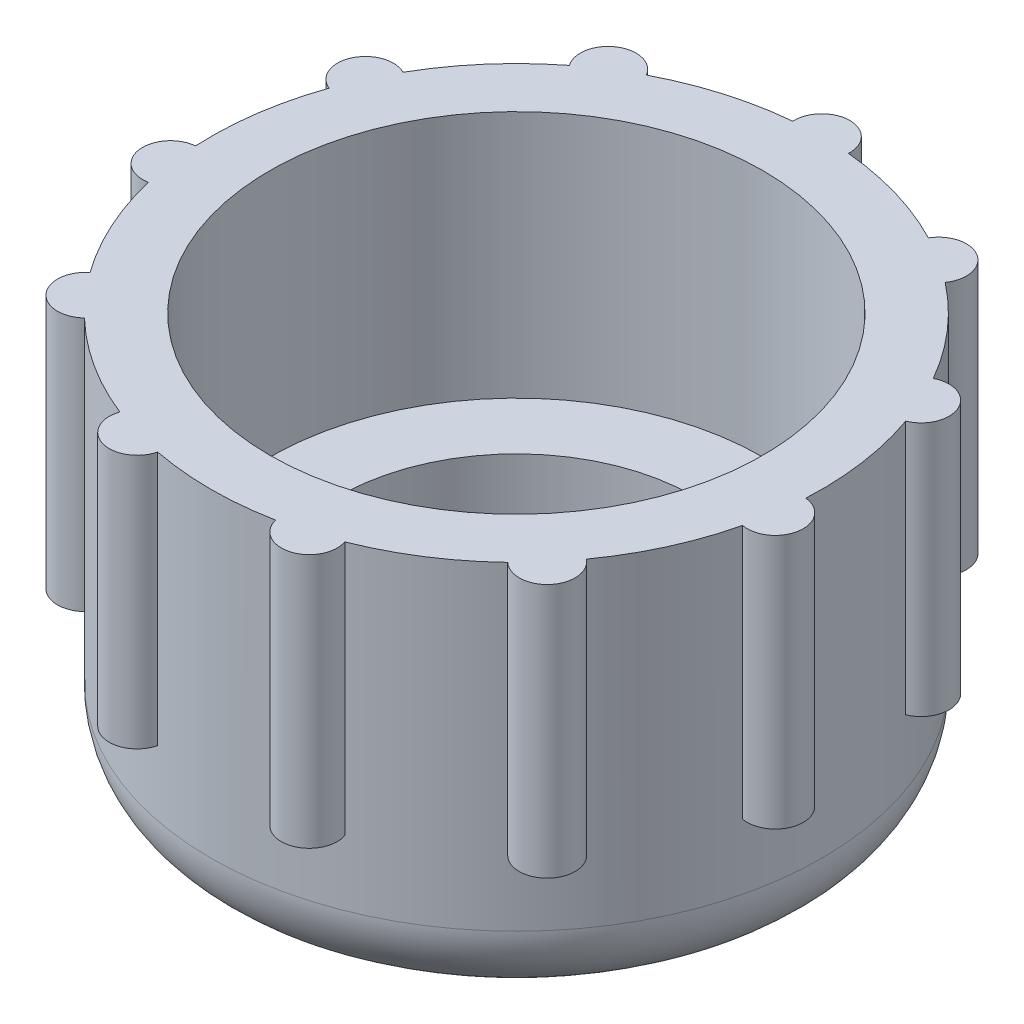
ISO-10303-21;
HEADER;
FILE_DESCRIPTION(('STEP AP214'),'2;1');
FILE_NAME('part.step','',(''),(''),'','','');
FILE_SCHEMA(('AUTOMOTIVE_DESIGN { 1 0 10303 214 1 1 1 1 }'));
ENDSEC;
DATA;
#1=APPLICATION_CONTEXT('core data for automotive mechanical design processes');
#2=APPLICATION_PROTOCOL_DEFINITION('international standard','automotive_design',2000,#1);
#3=PRODUCT_CONTEXT('',#1,'mechanical');
#4=PRODUCT('Part','Part','',(#3));
#5=PRODUCT_RELATED_PRODUCT_CATEGORY('part','',(#4));
#6=PRODUCT_DEFINITION_FORMATION('','',#4);
#7=PRODUCT_DEFINITION_CONTEXT('part definition',#1,'design');
#8=PRODUCT_DEFINITION('design','',#6,#7);
#9=PRODUCT_DEFINITION_SHAPE('','',#8);
#10=(LENGTH_UNIT() NAMED_UNIT(*) SI_UNIT(.MILLI.,.METRE.));
#11=(NAMED_UNIT(*) PLANE_ANGLE_UNIT() SI_UNIT($,.RADIAN.));
#12=(NAMED_UNIT(*) SI_UNIT($,.STERADIAN.) SOLID_ANGLE_UNIT());
#13=UNCERTAINTY_MEASURE_WITH_UNIT(LENGTH_MEASURE(1.E-05),#10,'distance_accuracy_value','');
#14=(GEOMETRIC_REPRESENTATION_CONTEXT(3) GLOBAL_UNCERTAINTY_ASSIGNED_CONTEXT((#13)) GLOBAL_UNIT_ASSIGNED_CONTEXT((#10,
#11,#12)) REPRESENTATION_CONTEXT('',''));
#15=CARTESIAN_POINT('',(0.,0.,0.));
#16=DIRECTION('',(0.,0.,1.));
#17=DIRECTION('',(1.,0.,0.));
#18=AXIS2_PLACEMENT_3D('',#15,#16,#17);
#19=CARTESIAN_POINT('',(0.,0.,0.));
#20=DIRECTION('',(0.,1.,0.));
#21=DIRECTION('',(0.,0.,1.));
#22=AXIS2_PLACEMENT_3D('',#19,#20,#21);
#23=CYLINDRICAL_SURFACE('',#22,14.605);
#24=CARTESIAN_POINT('',(0.,0.,0.));
#25=DIRECTION('',(0.,1.,0.));
#26=DIRECTION('',(0.,0.,1.));
#27=AXIS2_PLACEMENT_3D('',#24,#25,#26);
#28=CIRCLE('',#27,14.605);
#29=CARTESIAN_POINT('',(0.,0.,14.605));
#30=VERTEX_POINT('',#29);
#31=EDGE_CURVE('E329',#30,#30,#28,.T.);
#32=ORIENTED_EDGE('',*,*,#31,.F.);
#33=EDGE_LOOP('',(#32));
#34=FACE_BOUND('',#33,.T.);
#35=CARTESIAN_POINT('',(0.,12.192,0.));
#36=DIRECTION('',(0.,1.,0.));
#37=DIRECTION('',(0.,0.,1.));
#38=AXIS2_PLACEMENT_3D('',#35,#36,#37);
#39=CIRCLE('',#38,14.605);
#40=CARTESIAN_POINT('',(0.,12.192,14.605));
#41=VERTEX_POINT('',#40);
#42=EDGE_CURVE('E38',#41,#41,#39,.F.);
#43=ORIENTED_EDGE('',*,*,#42,.F.);
#44=EDGE_LOOP('',(#43));
#45=FACE_BOUND('',#44,.T.);
#46=ADVANCED_FACE('F34',(#34,#45),#23,.F.);
#47=CARTESIAN_POINT('',(0.,32.512,0.));
#48=DIRECTION('',(0.,-1.,0.));
#49=DIRECTION('',(0.,0.,-1.));
#50=AXIS2_PLACEMENT_3D('',#47,#48,#49);
#51=CYLINDRICAL_SURFACE('',#50,25.019);
#52=CARTESIAN_POINT('',(0.,6.35,0.));
#53=DIRECTION('',(0.,1.,0.));
#54=DIRECTION('',(0.,0.,1.));
#55=AXIS2_PLACEMENT_3D('',#52,#53,#54);
#56=CIRCLE('',#55,25.019);
#57=CARTESIAN_POINT('',(0.,6.35,25.019));
#58=VERTEX_POINT('',#57);
#59=EDGE_CURVE('E43',#58,#58,#56,.T.);
#60=ORIENTED_EDGE('',*,*,#59,.T.);
#61=EDGE_LOOP('',(#60));
#62=FACE_BOUND('',#61,.T.);
#63=CARTESIAN_POINT('',(0.,11.684,0.));
#64=DIRECTION('',(0.,-1.,0.));
#65=DIRECTION('',(-0.540640817455586,0.,0.841253532831188));
#66=AXIS2_PLACEMENT_3D('',#63,#64,#65);
#67=CIRCLE('',#66,25.019);
#68=CARTESIAN_POINT('',(11.5487323231708,11.684,-22.1940790015659));
#69=VERTEX_POINT('',#68);
#70=CARTESIAN_POINT('',(15.3909275790644,11.684,-19.7248500439419));
#71=VERTEX_POINT('',#70);
#72=EDGE_CURVE('E192',#69,#71,#67,.T.);
#73=ORIENTED_EDGE('',*,*,#72,.T.);
#74=DIRECTION('',(0.,1.,0.));
#75=VECTOR('',#74,1.);
#76=CARTESIAN_POINT('',(15.3909275790644,11.684,-19.7248500439419));
#77=LINE('',#76,#75);
#78=CARTESIAN_POINT('',(15.3909275790644,32.512,-19.7248500439419));
#79=VERTEX_POINT('',#78);
#80=EDGE_CURVE('E189',#71,#79,#77,.T.);
#81=ORIENTED_EDGE('',*,*,#80,.T.);
#82=CARTESIAN_POINT('',(0.,32.512,0.));
#83=DIRECTION('',(0.,1.,0.));
#84=DIRECTION('',(0.,0.,1.));
#85=AXIS2_PLACEMENT_3D('',#82,#83,#84);
#86=CIRCLE('',#85,25.019);
#87=CARTESIAN_POINT('',(21.7144368806698,32.512,-12.4271312842267));
#88=VERTEX_POINT('',#87);
#89=EDGE_CURVE('E416',#88,#79,#86,.T.);
#90=ORIENTED_EDGE('',*,*,#89,.F.);
#91=DIRECTION('',(0.,1.,0.));
#92=VECTOR('',#91,1.);
#93=CARTESIAN_POINT('',(21.7144368806698,11.684,-12.4271312842267));
#94=LINE('',#93,#92);
#95=CARTESIAN_POINT('',(21.7144368806698,11.684,-12.4271312842267));
#96=VERTEX_POINT('',#95);
#97=EDGE_CURVE('E209',#96,#88,#94,.T.);
#98=ORIENTED_EDGE('',*,*,#97,.F.);
#99=CARTESIAN_POINT('',(0.,11.684,0.));
#100=DIRECTION('',(0.,-1.,0.));
#101=DIRECTION('',(-0.909631995354513,0.,0.415415013001897));
#102=AXIS2_PLACEMENT_3D('',#99,#100,#101);
#103=CIRCLE('',#102,25.019);
#104=CARTESIAN_POINT('',(23.6117312513826,11.684,-8.27263611628607));
#105=VERTEX_POINT('',#104);
#106=EDGE_CURVE('E206',#96,#105,#103,.T.);
#107=ORIENTED_EDGE('',*,*,#106,.T.);
#108=DIRECTION('',(0.,1.,0.));
#109=VECTOR('',#108,1.);
#110=CARTESIAN_POINT('',(23.6117312513826,11.684,-8.27263611628607));
#111=LINE('',#110,#109);
#112=CARTESIAN_POINT('',(23.6117312513826,32.512,-8.27263611628607));
#113=VERTEX_POINT('',#112);
#114=EDGE_CURVE('E211',#105,#113,#111,.T.);
#115=ORIENTED_EDGE('',*,*,#114,.T.);
#116=CARTESIAN_POINT('',(24.9859611554355,32.512,1.28534280994073));
#117=VERTEX_POINT('',#116);
#118=EDGE_CURVE('E414',#117,#113,#86,.T.);
#119=ORIENTED_EDGE('',*,*,#118,.F.);
#120=DIRECTION('',(0.,1.,0.));
#121=VECTOR('',#120,1.);
#122=CARTESIAN_POINT('',(24.9859611554355,11.684,1.28534280994073));
#123=LINE('',#122,#121);
#124=CARTESIAN_POINT('',(24.9859611554355,11.684,1.28534280994073));
#125=VERTEX_POINT('',#124);
#126=EDGE_CURVE('E221',#125,#117,#123,.T.);
#127=ORIENTED_EDGE('',*,*,#126,.F.);
#128=CARTESIAN_POINT('',(0.,11.684,0.));
#129=DIRECTION('',(0.,-1.,0.));
#130=DIRECTION('',(-0.989821441880934,0.,-0.142314838273275));
#131=AXIS2_PLACEMENT_3D('',#128,#129,#130);
#132=CIRCLE('',#131,25.019);
#133=CARTESIAN_POINT('',(24.3359770839076,11.684,5.80608132663694));
#134=VERTEX_POINT('',#133);
#135=EDGE_CURVE('E218',#125,#134,#132,.T.);
#136=ORIENTED_EDGE('',*,*,#135,.T.);
#137=DIRECTION('',(0.,1.,0.));
#138=VECTOR('',#137,1.);
#139=CARTESIAN_POINT('',(24.3359770839076,11.684,5.80608132663694));
#140=LINE('',#139,#138);
#141=CARTESIAN_POINT('',(24.3359770839076,32.512,5.80608132663694));
#142=VERTEX_POINT('',#141);
#143=EDGE_CURVE('E223',#134,#142,#140,.T.);
#144=ORIENTED_EDGE('',*,*,#143,.T.);
#145=CARTESIAN_POINT('',(20.3246193057158,32.512,14.5897296437503));
#146=VERTEX_POINT('',#145);
#147=EDGE_CURVE('E411',#146,#142,#86,.T.);
#148=ORIENTED_EDGE('',*,*,#147,.F.);
#149=DIRECTION('',(0.,1.,0.));
#150=VECTOR('',#149,1.);
#151=CARTESIAN_POINT('',(20.3246193057157,11.684,14.5897296437503));
#152=LINE('',#151,#150);
#153=CARTESIAN_POINT('',(20.3246193057157,11.684,14.5897296437503));
#154=VERTEX_POINT('',#153);
#155=EDGE_CURVE('E234',#154,#146,#152,.T.);
#156=ORIENTED_EDGE('',*,*,#155,.F.);
#157=CARTESIAN_POINT('',(0.,11.684,0.));
#158=DIRECTION('',(0.,-1.,0.));
#159=DIRECTION('',(-0.755749574354264,0.,-0.654860733945278));
#160=AXIS2_PLACEMENT_3D('',#157,#158,#159);
#161=CIRCLE('',#160,25.019);
#162=CARTESIAN_POINT('',(17.3337221420893,11.684,18.041408972163));
#163=VERTEX_POINT('',#162);
#164=EDGE_CURVE('E231',#154,#163,#161,.T.);
#165=ORIENTED_EDGE('',*,*,#164,.T.);
#166=DIRECTION('',(0.,1.,0.));
#167=VECTOR('',#166,1.);
#168=CARTESIAN_POINT('',(17.3337221420893,11.684,18.041408972163));
#169=LINE('',#168,#167);
#170=CARTESIAN_POINT('',(17.3337221420893,32.512,18.041408972163));
#171=VERTEX_POINT('',#170);
#172=EDGE_CURVE('E236',#163,#171,#169,.T.);
#173=ORIENTED_EDGE('',*,*,#172,.T.);
#174=CARTESIAN_POINT('',(9.21035443332885,32.512,23.2619804017728));
#175=VERTEX_POINT('',#174);
#176=EDGE_CURVE('E408',#175,#171,#86,.T.);
#177=ORIENTED_EDGE('',*,*,#176,.F.);
#178=DIRECTION('',(0.,1.,0.));
#179=VECTOR('',#178,1.);
#180=CARTESIAN_POINT('',(9.21035443332884,11.684,23.2619804017727));
#181=LINE('',#180,#179);
#182=CARTESIAN_POINT('',(9.21035443332884,11.684,23.2619804017727));
#183=VERTEX_POINT('',#182);
#184=EDGE_CURVE('E247',#183,#175,#181,.T.);
#185=ORIENTED_EDGE('',*,*,#184,.F.);
#186=CARTESIAN_POINT('',(0.,11.684,0.));
#187=DIRECTION('',(0.,-1.,0.));
#188=DIRECTION('',(-0.281732556841437,0.,-0.959492973614495));
#189=AXIS2_PLACEMENT_3D('',#186,#187,#188);
#190=CIRCLE('',#189,25.019);
#191=CARTESIAN_POINT('',(4.82813289438566,11.684,24.5487167435316));
#192=VERTEX_POINT('',#191);
#193=EDGE_CURVE('E244',#183,#192,#190,.T.);
#194=ORIENTED_EDGE('',*,*,#193,.T.);
#195=DIRECTION('',(0.,1.,0.));
#196=VECTOR('',#195,1.);
#197=CARTESIAN_POINT('',(4.82813289438566,11.684,24.5487167435316));
#198=LINE('',#197,#196);
#199=CARTESIAN_POINT('',(4.82813289438566,32.512,24.5487167435316));
#200=VERTEX_POINT('',#199);
#201=EDGE_CURVE('E249',#192,#200,#198,.T.);
#202=ORIENTED_EDGE('',*,*,#201,.T.);
#203=CARTESIAN_POINT('',(-4.82813289438531,32.512,24.5487167435317));
#204=VERTEX_POINT('',#203);
#205=EDGE_CURVE('E405',#204,#200,#86,.T.);
#206=ORIENTED_EDGE('',*,*,#205,.F.);
#207=DIRECTION('',(0.,1.,0.));
#208=VECTOR('',#207,1.);
#209=CARTESIAN_POINT('',(-4.82813289438531,11.684,24.5487167435317));
#210=LINE('',#209,#208);
#211=CARTESIAN_POINT('',(-4.82813289438531,11.684,24.5487167435317));
#212=VERTEX_POINT('',#211);
#213=EDGE_CURVE('E260',#212,#204,#210,.T.);
#214=ORIENTED_EDGE('',*,*,#213,.F.);
#215=CARTESIAN_POINT('',(0.,11.684,0.));
#216=DIRECTION('',(0.,-1.,0.));
#217=DIRECTION('',(0.281732556841423,0.,-0.959492973614499));
#218=AXIS2_PLACEMENT_3D('',#215,#216,#217);
#219=CIRCLE('',#218,25.019);
#220=CARTESIAN_POINT('',(-9.21035443332852,11.684,23.2619804017729));
#221=VERTEX_POINT('',#220);
#222=EDGE_CURVE('E257',#212,#221,#219,.T.);
#223=ORIENTED_EDGE('',*,*,#222,.T.);
#224=DIRECTION('',(0.,1.,0.));
#225=VECTOR('',#224,1.);
#226=CARTESIAN_POINT('',(-9.21035443332852,11.684,23.2619804017729));
#227=LINE('',#226,#225);
#228=CARTESIAN_POINT('',(-9.21035443332852,32.512,23.2619804017729));
#229=VERTEX_POINT('',#228);
#230=EDGE_CURVE('E262',#221,#229,#227,.T.);
#231=ORIENTED_EDGE('',*,*,#230,.T.);
#232=CARTESIAN_POINT('',(-17.333722142089,32.512,18.0414089721633));
#233=VERTEX_POINT('',#232);
#234=EDGE_CURVE('E402',#233,#229,#86,.T.);
#235=ORIENTED_EDGE('',*,*,#234,.F.);
#236=DIRECTION('',(0.,1.,0.));
#237=VECTOR('',#236,1.);
#238=CARTESIAN_POINT('',(-17.333722142089,11.684,18.0414089721633));
#239=LINE('',#238,#237);
#240=CARTESIAN_POINT('',(-17.333722142089,11.684,18.0414089721633));
#241=VERTEX_POINT('',#240);
#242=EDGE_CURVE('E273',#241,#233,#239,.T.);
#243=ORIENTED_EDGE('',*,*,#242,.F.);
#244=CARTESIAN_POINT('',(0.,11.684,0.));
#245=DIRECTION('',(0.,-1.,0.));
#246=DIRECTION('',(0.755749574354255,0.,-0.654860733945289));
#247=AXIS2_PLACEMENT_3D('',#244,#245,#246);
#248=CIRCLE('',#247,25.019);
#249=CARTESIAN_POINT('',(-20.3246193057155,11.684,14.5897296437506));
#250=VERTEX_POINT('',#249);
#251=EDGE_CURVE('E270',#241,#250,#248,.T.);
#252=ORIENTED_EDGE('',*,*,#251,.T.);
#253=DIRECTION('',(0.,1.,0.));
#254=VECTOR('',#253,1.);
#255=CARTESIAN_POINT('',(-20.3246193057155,11.684,14.5897296437506));
#256=LINE('',#255,#254);
#257=CARTESIAN_POINT('',(-20.3246193057155,32.512,14.5897296437506));
#258=VERTEX_POINT('',#257);
#259=EDGE_CURVE('E275',#250,#258,#256,.T.);
#260=ORIENTED_EDGE('',*,*,#259,.T.);
#261=CARTESIAN_POINT('',(-24.3359770839076,32.512,5.80608132663729));
#262=VERTEX_POINT('',#261);
#263=EDGE_CURVE('E399',#262,#258,#86,.T.);
#264=ORIENTED_EDGE('',*,*,#263,.F.);
#265=DIRECTION('',(0.,1.,0.));
#266=VECTOR('',#265,1.);
#267=CARTESIAN_POINT('',(-24.3359770839076,11.684,5.80608132663729));
#268=LINE('',#267,#266);
#269=CARTESIAN_POINT('',(-24.3359770839076,11.684,5.80608132663729));
#270=VERTEX_POINT('',#269);
#271=EDGE_CURVE('E286',#270,#262,#268,.T.);
#272=ORIENTED_EDGE('',*,*,#271,.F.);
#273=CARTESIAN_POINT('',(0.,11.684,0.));
#274=DIRECTION('',(0.,-1.,0.));
#275=DIRECTION('',(0.989821441880932,0.,-0.142314838273289));
#276=AXIS2_PLACEMENT_3D('',#273,#274,#275);
#277=CIRCLE('',#276,25.019);
#278=CARTESIAN_POINT('',(-24.9859611554355,11.684,1.28534280994109));
#279=VERTEX_POINT('',#278);
#280=EDGE_CURVE('E283',#270,#279,#277,.T.);
#281=ORIENTED_EDGE('',*,*,#280,.T.);
#282=DIRECTION('',(0.,1.,0.));
#283=VECTOR('',#282,1.);
#284=CARTESIAN_POINT('',(-24.9859611554355,11.684,1.28534280994109));
#285=LINE('',#284,#283);
#286=CARTESIAN_POINT('',(-24.9859611554355,32.512,1.28534280994109));
#287=VERTEX_POINT('',#286);
#288=EDGE_CURVE('E288',#279,#287,#285,.T.);
#289=ORIENTED_EDGE('',*,*,#288,.T.);
#290=CARTESIAN_POINT('',(-23.6117312513828,32.512,-8.27263611628573));
#291=VERTEX_POINT('',#290);
#292=EDGE_CURVE('E397',#291,#287,#86,.T.);
#293=ORIENTED_EDGE('',*,*,#292,.F.);
#294=DIRECTION('',(0.,1.,0.));
#295=VECTOR('',#294,1.);
#296=CARTESIAN_POINT('',(-23.6117312513827,11.684,-8.27263611628573));
#297=LINE('',#296,#295);
#298=CARTESIAN_POINT('',(-23.6117312513827,11.684,-8.27263611628573));
#299=VERTEX_POINT('',#298);
#300=EDGE_CURVE('E299',#299,#291,#297,.T.);
#301=ORIENTED_EDGE('',*,*,#300,.F.);
#302=CARTESIAN_POINT('',(0.,11.684,0.));
#303=DIRECTION('',(0.,-1.,0.));
#304=DIRECTION('',(0.909631995354519,0.,0.415415013001884));
#305=AXIS2_PLACEMENT_3D('',#302,#303,#304);
#306=CIRCLE('',#305,25.019);
#307=CARTESIAN_POINT('',(-21.71443688067,11.684,-12.4271312842264));
#308=VERTEX_POINT('',#307);
#309=EDGE_CURVE('E296',#299,#308,#306,.T.);
#310=ORIENTED_EDGE('',*,*,#309,.T.);
#311=DIRECTION('',(0.,1.,0.));
#312=VECTOR('',#311,1.);
#313=CARTESIAN_POINT('',(-21.71443688067,11.684,-12.4271312842264));
#314=LINE('',#313,#312);
#315=CARTESIAN_POINT('',(-21.71443688067,32.512,-12.4271312842264));
#316=VERTEX_POINT('',#315);
#317=EDGE_CURVE('E301',#308,#316,#314,.T.);
#318=ORIENTED_EDGE('',*,*,#317,.T.);
#319=CARTESIAN_POINT('',(-15.3909275790647,32.512,-19.7248500439417));
#320=VERTEX_POINT('',#319);
#321=EDGE_CURVE('E337',#320,#316,#86,.T.);
#322=ORIENTED_EDGE('',*,*,#321,.F.);
#323=DIRECTION('',(0.,1.,0.));
#324=VECTOR('',#323,1.);
#325=CARTESIAN_POINT('',(-15.3909275790647,11.684,-19.7248500439417));
#326=LINE('',#325,#324);
#327=CARTESIAN_POINT('',(-15.3909275790647,11.684,-19.7248500439417));
#328=VERTEX_POINT('',#327);
#329=EDGE_CURVE('E312',#328,#320,#326,.T.);
#330=ORIENTED_EDGE('',*,*,#329,.F.);
#331=CARTESIAN_POINT('',(0.,11.684,0.));
#332=DIRECTION('',(0.,-1.,0.));
#333=DIRECTION('',(0.540640817455599,0.,0.841253532831181));
#334=AXIS2_PLACEMENT_3D('',#331,#332,#333);
#335=CIRCLE('',#334,25.019);
#336=CARTESIAN_POINT('',(-11.5487323231711,11.684,-22.1940790015658));
#337=VERTEX_POINT('',#336);
#338=EDGE_CURVE('E309',#328,#337,#335,.T.);
#339=ORIENTED_EDGE('',*,*,#338,.T.);
#340=DIRECTION('',(0.,1.,0.));
#341=VECTOR('',#340,1.);
#342=CARTESIAN_POINT('',(-11.5487323231711,11.684,-22.1940790015658));
#343=LINE('',#342,#341);
#344=CARTESIAN_POINT('',(-11.5487323231711,32.512,-22.1940790015658));
#345=VERTEX_POINT('',#344);
#346=EDGE_CURVE('E314',#337,#345,#343,.T.);
#347=ORIENTED_EDGE('',*,*,#346,.T.);
#348=CARTESIAN_POINT('',(-2.2836131474913,32.512,-24.9145634517766));
#349=VERTEX_POINT('',#348);
#350=EDGE_CURVE('E334',#349,#345,#86,.T.);
#351=ORIENTED_EDGE('',*,*,#350,.F.);
#352=DIRECTION('',(0.,1.,0.));
#353=VECTOR('',#352,1.);
#354=CARTESIAN_POINT('',(-2.2836131474913,11.684,-24.9145634517766));
#355=LINE('',#354,#353);
#356=CARTESIAN_POINT('',(-2.2836131474913,11.684,-24.9145634517766));
#357=VERTEX_POINT('',#356);
#358=EDGE_CURVE('E325',#357,#349,#355,.T.);
#359=ORIENTED_EDGE('',*,*,#358,.F.);
#360=CARTESIAN_POINT('',(0.,11.684,0.));
#361=DIRECTION('',(0.,-1.,0.));
#362=DIRECTION('',(0.,0.,1.));
#363=AXIS2_PLACEMENT_3D('',#360,#361,#362);
#364=CIRCLE('',#363,25.019);
#365=CARTESIAN_POINT('',(2.28361314749131,11.684,-24.9145634517766));
#366=VERTEX_POINT('',#365);
#367=EDGE_CURVE('E322',#357,#366,#364,.T.);
#368=ORIENTED_EDGE('',*,*,#367,.T.);
#369=DIRECTION('',(0.,1.,0.));
#370=VECTOR('',#369,1.);
#371=CARTESIAN_POINT('',(2.28361314749131,11.684,-24.9145634517766));
#372=LINE('',#371,#370);
#373=CARTESIAN_POINT('',(2.28361314749131,32.512,-24.9145634517766));
#374=VERTEX_POINT('',#373);
#375=EDGE_CURVE('E327',#366,#374,#372,.T.);
#376=ORIENTED_EDGE('',*,*,#375,.T.);
#377=CARTESIAN_POINT('',(11.5487323231708,32.512,-22.1940790015659));
#378=VERTEX_POINT('',#377);
#379=EDGE_CURVE('E199',#378,#374,#86,.T.);
#380=ORIENTED_EDGE('',*,*,#379,.F.);
#381=DIRECTION('',(0.,1.,0.));
#382=VECTOR('',#381,1.);
#383=CARTESIAN_POINT('',(11.5487323231708,11.684,-22.1940790015659));
#384=LINE('',#383,#382);
#385=EDGE_CURVE('E186',#69,#378,#384,.T.);
#386=ORIENTED_EDGE('',*,*,#385,.F.);
#387=EDGE_LOOP('',(#73,#81,#90,#98,#107,#115,#119,#127,#136,#144,#148,#156,#165,#173,#177,#185,
#194,#202,#206,#214,#223,#231,#235,#243,#252,#260,#264,#272,#281,#289,#293,#301,#310,#318,#322,
#330,#339,#347,#351,#359,#368,#376,#380,#386));
#388=FACE_BOUND('',#387,.T.);
#389=ADVANCED_FACE('F197',(#62,#388),#51,.T.);
#390=CARTESIAN_POINT('',(0.,32.512,0.));
#391=DIRECTION('',(0.,1.,0.));
#392=DIRECTION('',(0.,0.,1.));
#393=AXIS2_PLACEMENT_3D('',#390,#391,#392);
#394=PLANE('',#393);
#395=CARTESIAN_POINT('',(0.,32.512,0.));
#396=DIRECTION('',(0.,1.,0.));
#397=DIRECTION('',(0.,0.,1.));
#398=AXIS2_PLACEMENT_3D('',#395,#396,#397);
#399=CIRCLE('',#398,20.193);
#400=CARTESIAN_POINT('',(0.,32.512,20.193));
#401=VERTEX_POINT('',#400);
#402=EDGE_CURVE('E624',#401,#401,#399,.T.);
#403=ORIENTED_EDGE('',*,*,#402,.F.);
#404=EDGE_LOOP('',(#403));
#405=FACE_BOUND('',#404,.T.);
#406=ORIENTED_EDGE('',*,*,#350,.T.);
#407=CARTESIAN_POINT('',(-13.5262926119216,32.512,-21.0473221379033));
#408=DIRECTION('',(0.,1.,0.));
#409=DIRECTION('',(0.540640817455599,0.,0.841253532831181));
#410=AXIS2_PLACEMENT_3D('',#407,#408,#409);
#411=CIRCLE('',#410,2.286);
#412=EDGE_CURVE('E304',#345,#320,#411,.T.);
#413=ORIENTED_EDGE('',*,*,#412,.T.);
#414=ORIENTED_EDGE('',*,*,#321,.T.);
#415=CARTESIAN_POINT('',(-22.7580828917747,32.512,-10.3932682102941));
#416=DIRECTION('',(0.,1.,0.));
#417=DIRECTION('',(0.909631995354519,0.,0.415415013001884));
#418=AXIS2_PLACEMENT_3D('',#415,#416,#417);
#419=CIRCLE('',#418,2.286);
#420=EDGE_CURVE('E291',#316,#291,#419,.T.);
#421=ORIENTED_EDGE('',*,*,#420,.T.);
#422=ORIENTED_EDGE('',*,*,#292,.T.);
#423=CARTESIAN_POINT('',(-24.764342654419,32.512,3.56057493875942));
#424=DIRECTION('',(0.,1.,0.));
#425=DIRECTION('',(0.989821441880932,0.,-0.142314838273289));
#426=AXIS2_PLACEMENT_3D('',#423,#424,#425);
#427=CIRCLE('',#426,2.286);
#428=EDGE_CURVE('E278',#287,#262,#427,.T.);
#429=ORIENTED_EDGE('',*,*,#428,.T.);
#430=ORIENTED_EDGE('',*,*,#263,.T.);
#431=CARTESIAN_POINT('',(-18.9080986007691,32.512,16.3839607025772));
#432=DIRECTION('',(0.,1.,0.));
#433=DIRECTION('',(0.755749574354255,0.,-0.654860733945289));
#434=AXIS2_PLACEMENT_3D('',#431,#432,#433);
#435=CIRCLE('',#434,2.286);
#436=EDGE_CURVE('E265',#258,#233,#435,.T.);
#437=ORIENTED_EDGE('',*,*,#436,.T.);
#438=ORIENTED_EDGE('',*,*,#234,.T.);
#439=CARTESIAN_POINT('',(-7.04866683961557,32.512,24.0055547068612));
#440=DIRECTION('',(0.,1.,0.));
#441=DIRECTION('',(0.281732556841423,0.,-0.959492973614499));
#442=AXIS2_PLACEMENT_3D('',#439,#440,#441);
#443=CIRCLE('',#442,2.286);
#444=EDGE_CURVE('E252',#229,#204,#443,.T.);
#445=ORIENTED_EDGE('',*,*,#444,.T.);
#446=ORIENTED_EDGE('',*,*,#205,.T.);
#447=CARTESIAN_POINT('',(7.04866683961592,32.512,24.0055547068611));
#448=DIRECTION('',(0.,1.,0.));
#449=DIRECTION('',(-0.281732556841437,0.,-0.959492973614495));
#450=AXIS2_PLACEMENT_3D('',#447,#448,#449);
#451=CIRCLE('',#450,2.286);
#452=EDGE_CURVE('E239',#200,#175,#451,.T.);
#453=ORIENTED_EDGE('',*,*,#452,.T.);
#454=ORIENTED_EDGE('',*,*,#176,.T.);
#455=CARTESIAN_POINT('',(18.9080986007693,32.512,16.3839607025769));
#456=DIRECTION('',(0.,1.,0.));
#457=DIRECTION('',(-0.755749574354264,0.,-0.654860733945278));
#458=AXIS2_PLACEMENT_3D('',#455,#456,#457);
#459=CIRCLE('',#458,2.286);
#460=EDGE_CURVE('E226',#171,#146,#459,.T.);
#461=ORIENTED_EDGE('',*,*,#460,.T.);
#462=ORIENTED_EDGE('',*,*,#147,.T.);
#463=CARTESIAN_POINT('',(24.7643426544191,32.512,3.56057493875906));
#464=DIRECTION('',(0.,1.,0.));
#465=DIRECTION('',(-0.989821441880934,0.,-0.142314838273275));
#466=AXIS2_PLACEMENT_3D('',#463,#464,#465);
#467=CIRCLE('',#466,2.286);
#468=EDGE_CURVE('E214',#142,#117,#467,.T.);
#469=ORIENTED_EDGE('',*,*,#468,.T.);
#470=ORIENTED_EDGE('',*,*,#118,.T.);
#471=CARTESIAN_POINT('',(22.7580828917746,32.512,-10.3932682102945));
#472=DIRECTION('',(0.,1.,0.));
#473=DIRECTION('',(-0.909631995354513,0.,0.415415013001897));
#474=AXIS2_PLACEMENT_3D('',#471,#472,#473);
#475=CIRCLE('',#474,2.286);
#476=EDGE_CURVE('E56',#113,#88,#475,.T.);
#477=ORIENTED_EDGE('',*,*,#476,.T.);
#478=ORIENTED_EDGE('',*,*,#89,.T.);
#479=CARTESIAN_POINT('',(13.5262926119213,32.512,-21.0473221379035));
#480=DIRECTION('',(0.,1.,0.));
#481=DIRECTION('',(-0.540640817455586,0.,0.841253532831188));
#482=AXIS2_PLACEMENT_3D('',#479,#480,#481);
#483=CIRCLE('',#482,2.286);
#484=EDGE_CURVE('E50',#79,#378,#483,.T.);
#485=ORIENTED_EDGE('',*,*,#484,.T.);
#486=ORIENTED_EDGE('',*,*,#379,.T.);
#487=CARTESIAN_POINT('',(0.,32.512,-25.019));
#488=DIRECTION('',(0.,1.,0.));
#489=DIRECTION('',(0.,0.,1.));
#490=AXIS2_PLACEMENT_3D('',#487,#488,#489);
#491=CIRCLE('',#490,2.286);
#492=EDGE_CURVE('E317',#374,#349,#491,.T.);
#493=ORIENTED_EDGE('',*,*,#492,.T.);
#494=EDGE_LOOP('',(#406,#413,#414,#421,#422,#429,#430,#437,#438,#445,#446,#453,#454,#461,#462,
#469,#470,#477,#478,#485,#486,#493));
#495=FACE_BOUND('',#494,.T.);
#496=ADVANCED_FACE('F362',(#405,#495),#394,.T.);
#497=CARTESIAN_POINT('',(0.,0.,0.));
#498=DIRECTION('',(0.,1.,0.));
#499=DIRECTION('',(0.,0.,1.));
#500=AXIS2_PLACEMENT_3D('',#497,#498,#499);
#501=PLANE('',#500);
#502=CARTESIAN_POINT('',(0.,0.,0.));
#503=DIRECTION('',(0.,1.,0.));
#504=DIRECTION('',(0.,0.,1.));
#505=AXIS2_PLACEMENT_3D('',#502,#503,#504);
#506=CIRCLE('',#505,18.669);
#507=CARTESIAN_POINT('',(0.,0.,18.669));
#508=VERTEX_POINT('',#507);
#509=EDGE_CURVE('E11',#508,#508,#506,.F.);
#510=ORIENTED_EDGE('',*,*,#509,.T.);
#511=EDGE_LOOP('',(#510));
#512=FACE_BOUND('',#511,.T.);
#513=ORIENTED_EDGE('',*,*,#31,.T.);
#514=EDGE_LOOP('',(#513));
#515=FACE_BOUND('',#514,.T.);
#516=ADVANCED_FACE('F370',(#512,#515),#501,.F.);
#517=CARTESIAN_POINT('',(0.,11.684,-25.019));
#518=DIRECTION('',(0.,1.,0.));
#519=DIRECTION('',(0.,0.,1.));
#520=AXIS2_PLACEMENT_3D('',#517,#518,#519);
#521=CYLINDRICAL_SURFACE('',#520,2.286);
#522=ORIENTED_EDGE('',*,*,#492,.F.);
#523=ORIENTED_EDGE('',*,*,#375,.F.);
#524=CARTESIAN_POINT('',(0.,11.684,-25.019));
#525=DIRECTION('',(0.,1.,0.));
#526=DIRECTION('',(0.,0.,1.));
#527=AXIS2_PLACEMENT_3D('',#524,#525,#526);
#528=CIRCLE('',#527,2.286);
#529=EDGE_CURVE('E320',#366,#357,#528,.T.);
#530=ORIENTED_EDGE('',*,*,#529,.T.);
#531=ORIENTED_EDGE('',*,*,#358,.T.);
#532=EDGE_LOOP('',(#522,#523,#530,#531));
#533=FACE_BOUND('',#532,.T.);
#534=ADVANCED_FACE('F367',(#533),#521,.T.);
#535=CARTESIAN_POINT('',(0.,11.684,-12.5095));
#536=DIRECTION('',(0.,1.,0.));
#537=DIRECTION('',(0.,0.,1.));
#538=AXIS2_PLACEMENT_3D('',#535,#536,#537);
#539=PLANE('',#538);
#540=ORIENTED_EDGE('',*,*,#529,.F.);
#541=ORIENTED_EDGE('',*,*,#367,.F.);
#542=EDGE_LOOP('',(#540,#541));
#543=FACE_BOUND('',#542,.T.);
#544=ADVANCED_FACE('F378',(#543),#539,.F.);
#545=CARTESIAN_POINT('',(-13.5262926119216,11.684,-21.0473221379033));
#546=DIRECTION('',(0.,1.,0.));
#547=DIRECTION('',(0.,0.,1.));
#548=AXIS2_PLACEMENT_3D('',#545,#546,#547);
#549=CYLINDRICAL_SURFACE('',#548,2.286);
#550=ORIENTED_EDGE('',*,*,#412,.F.);
#551=ORIENTED_EDGE('',*,*,#346,.F.);
#552=CARTESIAN_POINT('',(-13.5262926119216,11.684,-21.0473221379033));
#553=DIRECTION('',(0.,1.,0.));
#554=DIRECTION('',(0.540640817455599,0.,0.841253532831181));
#555=AXIS2_PLACEMENT_3D('',#552,#553,#554);
#556=CIRCLE('',#555,2.286);
#557=EDGE_CURVE('E307',#337,#328,#556,.T.);
#558=ORIENTED_EDGE('',*,*,#557,.T.);
#559=ORIENTED_EDGE('',*,*,#329,.T.);
#560=EDGE_LOOP('',(#550,#551,#558,#559));
#561=FACE_BOUND('',#560,.T.);
#562=ADVANCED_FACE('F384',(#561),#549,.T.);
#563=CARTESIAN_POINT('',(-6.76314630596081,11.684,-10.5236610689517));
#564=DIRECTION('',(0.,1.,0.));
#565=DIRECTION('',(0.540640817455599,0.,0.841253532831181));
#566=AXIS2_PLACEMENT_3D('',#563,#564,#565);
#567=PLANE('',#566);
#568=ORIENTED_EDGE('',*,*,#557,.F.);
#569=ORIENTED_EDGE('',*,*,#338,.F.);
#570=EDGE_LOOP('',(#568,#569));
#571=FACE_BOUND('',#570,.T.);
#572=ADVANCED_FACE('F490',(#571),#567,.F.);
#573=CARTESIAN_POINT('',(-22.7580828917747,11.684,-10.3932682102941));
#574=DIRECTION('',(0.,1.,0.));
#575=DIRECTION('',(0.,0.,1.));
#576=AXIS2_PLACEMENT_3D('',#573,#574,#575);
#577=CYLINDRICAL_SURFACE('',#576,2.286);
#578=ORIENTED_EDGE('',*,*,#420,.F.);
#579=ORIENTED_EDGE('',*,*,#317,.F.);
#580=CARTESIAN_POINT('',(-22.7580828917747,11.684,-10.3932682102941));
#581=DIRECTION('',(0.,1.,0.));
#582=DIRECTION('',(0.909631995354519,0.,0.415415013001884));
#583=AXIS2_PLACEMENT_3D('',#580,#581,#582);
#584=CIRCLE('',#583,2.286);
#585=EDGE_CURVE('E294',#308,#299,#584,.T.);
#586=ORIENTED_EDGE('',*,*,#585,.T.);
#587=ORIENTED_EDGE('',*,*,#300,.T.);
#588=EDGE_LOOP('',(#578,#579,#586,#587));
#589=FACE_BOUND('',#588,.T.);
#590=ADVANCED_FACE('F486',(#589),#577,.T.);
#591=CARTESIAN_POINT('',(-11.3790414458874,11.684,-5.19663410514707));
#592=DIRECTION('',(0.,1.,0.));
#593=DIRECTION('',(0.909631995354519,0.,0.415415013001884));
#594=AXIS2_PLACEMENT_3D('',#591,#592,#593);
#595=PLANE('',#594);
#596=ORIENTED_EDGE('',*,*,#585,.F.);
#597=ORIENTED_EDGE('',*,*,#309,.F.);
#598=EDGE_LOOP('',(#596,#597));
#599=FACE_BOUND('',#598,.T.);
#600=ADVANCED_FACE('F482',(#599),#595,.F.);
#601=CARTESIAN_POINT('',(-24.764342654419,11.684,3.56057493875942));
#602=DIRECTION('',(0.,1.,0.));
#603=DIRECTION('',(0.,0.,1.));
#604=AXIS2_PLACEMENT_3D('',#601,#602,#603);
#605=CYLINDRICAL_SURFACE('',#604,2.286);
#606=ORIENTED_EDGE('',*,*,#428,.F.);
#607=ORIENTED_EDGE('',*,*,#288,.F.);
#608=CARTESIAN_POINT('',(-24.764342654419,11.684,3.56057493875942));
#609=DIRECTION('',(0.,1.,0.));
#610=DIRECTION('',(0.989821441880932,0.,-0.142314838273289));
#611=AXIS2_PLACEMENT_3D('',#608,#609,#610);
#612=CIRCLE('',#611,2.286);
#613=EDGE_CURVE('E281',#279,#270,#612,.T.);
#614=ORIENTED_EDGE('',*,*,#613,.T.);
#615=ORIENTED_EDGE('',*,*,#271,.T.);
#616=EDGE_LOOP('',(#606,#607,#614,#615));
#617=FACE_BOUND('',#616,.T.);
#618=ADVANCED_FACE('F478',(#617),#605,.T.);
#619=CARTESIAN_POINT('',(-12.3821713272095,11.684,1.78028746937971));
#620=DIRECTION('',(0.,1.,0.));
#621=DIRECTION('',(0.989821441880932,0.,-0.142314838273289));
#622=AXIS2_PLACEMENT_3D('',#619,#620,#621);
#623=PLANE('',#622);
#624=ORIENTED_EDGE('',*,*,#613,.F.);
#625=ORIENTED_EDGE('',*,*,#280,.F.);
#626=EDGE_LOOP('',(#624,#625));
#627=FACE_BOUND('',#626,.T.);
#628=ADVANCED_FACE('F474',(#627),#623,.F.);
#629=CARTESIAN_POINT('',(-18.9080986007691,11.684,16.3839607025772));
#630=DIRECTION('',(0.,1.,0.));
#631=DIRECTION('',(0.,0.,1.));
#632=AXIS2_PLACEMENT_3D('',#629,#630,#631);
#633=CYLINDRICAL_SURFACE('',#632,2.286);
#634=ORIENTED_EDGE('',*,*,#436,.F.);
#635=ORIENTED_EDGE('',*,*,#259,.F.);
#636=CARTESIAN_POINT('',(-18.9080986007691,11.684,16.3839607025772));
#637=DIRECTION('',(0.,1.,0.));
#638=DIRECTION('',(0.755749574354255,0.,-0.654860733945289));
#639=AXIS2_PLACEMENT_3D('',#636,#637,#638);
#640=CIRCLE('',#639,2.286);
#641=EDGE_CURVE('E268',#250,#241,#640,.T.);
#642=ORIENTED_EDGE('',*,*,#641,.T.);
#643=ORIENTED_EDGE('',*,*,#242,.T.);
#644=EDGE_LOOP('',(#634,#635,#642,#643));
#645=FACE_BOUND('',#644,.T.);
#646=ADVANCED_FACE('F470',(#645),#633,.T.);
#647=CARTESIAN_POINT('',(-9.45404930038455,11.684,8.19198035128859));
#648=DIRECTION('',(0.,1.,0.));
#649=DIRECTION('',(0.755749574354255,0.,-0.654860733945289));
#650=AXIS2_PLACEMENT_3D('',#647,#648,#649);
#651=PLANE('',#650);
#652=ORIENTED_EDGE('',*,*,#641,.F.);
#653=ORIENTED_EDGE('',*,*,#251,.F.);
#654=EDGE_LOOP('',(#652,#653));
#655=FACE_BOUND('',#654,.T.);
#656=ADVANCED_FACE('F466',(#655),#651,.F.);
#657=CARTESIAN_POINT('',(-7.04866683961557,11.684,24.0055547068612));
#658=DIRECTION('',(0.,1.,0.));
#659=DIRECTION('',(0.,0.,1.));
#660=AXIS2_PLACEMENT_3D('',#657,#658,#659);
#661=CYLINDRICAL_SURFACE('',#660,2.286);
#662=ORIENTED_EDGE('',*,*,#444,.F.);
#663=ORIENTED_EDGE('',*,*,#230,.F.);
#664=CARTESIAN_POINT('',(-7.04866683961557,11.684,24.0055547068612));
#665=DIRECTION('',(0.,1.,0.));
#666=DIRECTION('',(0.281732556841423,0.,-0.959492973614499));
#667=AXIS2_PLACEMENT_3D('',#664,#665,#666);
#668=CIRCLE('',#667,2.286);
#669=EDGE_CURVE('E255',#221,#212,#668,.T.);
#670=ORIENTED_EDGE('',*,*,#669,.T.);
#671=ORIENTED_EDGE('',*,*,#213,.T.);
#672=EDGE_LOOP('',(#662,#663,#670,#671));
#673=FACE_BOUND('',#672,.T.);
#674=ADVANCED_FACE('F462',(#673),#661,.T.);
#675=CARTESIAN_POINT('',(-3.52433341980778,11.684,12.0027773534306));
#676=DIRECTION('',(0.,1.,0.));
#677=DIRECTION('',(0.281732556841423,0.,-0.959492973614499));
#678=AXIS2_PLACEMENT_3D('',#675,#676,#677);
#679=PLANE('',#678);
#680=ORIENTED_EDGE('',*,*,#669,.F.);
#681=ORIENTED_EDGE('',*,*,#222,.F.);
#682=EDGE_LOOP('',(#680,#681));
#683=FACE_BOUND('',#682,.T.);
#684=ADVANCED_FACE('F458',(#683),#679,.F.);
#685=CARTESIAN_POINT('',(7.04866683961592,11.684,24.0055547068611));
#686=DIRECTION('',(0.,1.,0.));
#687=DIRECTION('',(0.,0.,1.));
#688=AXIS2_PLACEMENT_3D('',#685,#686,#687);
#689=CYLINDRICAL_SURFACE('',#688,2.286);
#690=ORIENTED_EDGE('',*,*,#452,.F.);
#691=ORIENTED_EDGE('',*,*,#201,.F.);
#692=CARTESIAN_POINT('',(7.04866683961592,11.684,24.0055547068611));
#693=DIRECTION('',(0.,1.,0.));
#694=DIRECTION('',(-0.281732556841437,0.,-0.959492973614495));
#695=AXIS2_PLACEMENT_3D('',#692,#693,#694);
#696=CIRCLE('',#695,2.286);
#697=EDGE_CURVE('E242',#192,#183,#696,.T.);
#698=ORIENTED_EDGE('',*,*,#697,.T.);
#699=ORIENTED_EDGE('',*,*,#184,.T.);
#700=EDGE_LOOP('',(#690,#691,#698,#699));
#701=FACE_BOUND('',#700,.T.);
#702=ADVANCED_FACE('F454',(#701),#689,.T.);
#703=CARTESIAN_POINT('',(3.52433341980796,11.684,12.0027773534305));
#704=DIRECTION('',(0.,1.,0.));
#705=DIRECTION('',(-0.281732556841437,0.,-0.959492973614495));
#706=AXIS2_PLACEMENT_3D('',#703,#704,#705);
#707=PLANE('',#706);
#708=ORIENTED_EDGE('',*,*,#697,.F.);
#709=ORIENTED_EDGE('',*,*,#193,.F.);
#710=EDGE_LOOP('',(#708,#709));
#711=FACE_BOUND('',#710,.T.);
#712=ADVANCED_FACE('F450',(#711),#707,.F.);
#713=CARTESIAN_POINT('',(18.9080986007693,11.684,16.3839607025769));
#714=DIRECTION('',(0.,1.,0.));
#715=DIRECTION('',(0.,0.,1.));
#716=AXIS2_PLACEMENT_3D('',#713,#714,#715);
#717=CYLINDRICAL_SURFACE('',#716,2.286);
#718=ORIENTED_EDGE('',*,*,#460,.F.);
#719=ORIENTED_EDGE('',*,*,#172,.F.);
#720=CARTESIAN_POINT('',(18.9080986007693,11.684,16.3839607025769));
#721=DIRECTION('',(0.,1.,0.));
#722=DIRECTION('',(-0.755749574354264,0.,-0.654860733945278));
#723=AXIS2_PLACEMENT_3D('',#720,#721,#722);
#724=CIRCLE('',#723,2.286);
#725=EDGE_CURVE('E229',#163,#154,#724,.T.);
#726=ORIENTED_EDGE('',*,*,#725,.T.);
#727=ORIENTED_EDGE('',*,*,#155,.T.);
#728=EDGE_LOOP('',(#718,#719,#726,#727));
#729=FACE_BOUND('',#728,.T.);
#730=ADVANCED_FACE('F446',(#729),#717,.T.);
#731=CARTESIAN_POINT('',(9.45404930038467,11.684,8.19198035128846));
#732=DIRECTION('',(0.,1.,0.));
#733=DIRECTION('',(-0.755749574354264,0.,-0.654860733945278));
#734=AXIS2_PLACEMENT_3D('',#731,#732,#733);
#735=PLANE('',#734);
#736=ORIENTED_EDGE('',*,*,#725,.F.);
#737=ORIENTED_EDGE('',*,*,#164,.F.);
#738=EDGE_LOOP('',(#736,#737));
#739=FACE_BOUND('',#738,.T.);
#740=ADVANCED_FACE('F442',(#739),#735,.F.);
#741=CARTESIAN_POINT('',(24.7643426544191,11.684,3.56057493875906));
#742=DIRECTION('',(0.,1.,0.));
#743=DIRECTION('',(0.,0.,1.));
#744=AXIS2_PLACEMENT_3D('',#741,#742,#743);
#745=CYLINDRICAL_SURFACE('',#744,2.286);
#746=ORIENTED_EDGE('',*,*,#468,.F.);
#747=ORIENTED_EDGE('',*,*,#143,.F.);
#748=CARTESIAN_POINT('',(24.7643426544191,11.684,3.56057493875906));
#749=DIRECTION('',(0.,1.,0.));
#750=DIRECTION('',(-0.989821441880934,0.,-0.142314838273275));
#751=AXIS2_PLACEMENT_3D('',#748,#749,#750);
#752=CIRCLE('',#751,2.286);
#753=EDGE_CURVE('E216',#134,#125,#752,.T.);
#754=ORIENTED_EDGE('',*,*,#753,.T.);
#755=ORIENTED_EDGE('',*,*,#126,.T.);
#756=EDGE_LOOP('',(#746,#747,#754,#755));
#757=FACE_BOUND('',#756,.T.);
#758=ADVANCED_FACE('F438',(#757),#745,.T.);
#759=CARTESIAN_POINT('',(12.3821713272095,11.684,1.78028746937953));
#760=DIRECTION('',(0.,1.,0.));
#761=DIRECTION('',(-0.989821441880934,0.,-0.142314838273275));
#762=AXIS2_PLACEMENT_3D('',#759,#760,#761);
#763=PLANE('',#762);
#764=ORIENTED_EDGE('',*,*,#753,.F.);
#765=ORIENTED_EDGE('',*,*,#135,.F.);
#766=EDGE_LOOP('',(#764,#765));
#767=FACE_BOUND('',#766,.T.);
#768=ADVANCED_FACE('F433',(#767),#763,.F.);
#769=CARTESIAN_POINT('',(22.7580828917746,11.684,-10.3932682102945));
#770=DIRECTION('',(0.,1.,0.));
#771=DIRECTION('',(0.,0.,1.));
#772=AXIS2_PLACEMENT_3D('',#769,#770,#771);
#773=CYLINDRICAL_SURFACE('',#772,2.286);
#774=ORIENTED_EDGE('',*,*,#476,.F.);
#775=ORIENTED_EDGE('',*,*,#114,.F.);
#776=CARTESIAN_POINT('',(22.7580828917746,11.684,-10.3932682102945));
#777=DIRECTION('',(0.,1.,0.));
#778=DIRECTION('',(-0.909631995354513,0.,0.415415013001897));
#779=AXIS2_PLACEMENT_3D('',#776,#777,#778);
#780=CIRCLE('',#779,2.286);
#781=EDGE_CURVE('E204',#105,#96,#780,.T.);
#782=ORIENTED_EDGE('',*,*,#781,.T.);
#783=ORIENTED_EDGE('',*,*,#97,.T.);
#784=EDGE_LOOP('',(#774,#775,#782,#783));
#785=FACE_BOUND('',#784,.T.);
#786=ADVANCED_FACE('F422',(#785),#773,.T.);
#787=CARTESIAN_POINT('',(11.3790414458873,11.684,-5.19663410514723));
#788=DIRECTION('',(0.,1.,0.));
#789=DIRECTION('',(-0.909631995354513,0.,0.415415013001897));
#790=AXIS2_PLACEMENT_3D('',#787,#788,#789);
#791=PLANE('',#790);
#792=ORIENTED_EDGE('',*,*,#781,.F.);
#793=ORIENTED_EDGE('',*,*,#106,.F.);
#794=EDGE_LOOP('',(#792,#793));
#795=FACE_BOUND('',#794,.T.);
#796=ADVANCED_FACE('F425',(#795),#791,.F.);
#797=CARTESIAN_POINT('',(13.5262926119213,11.684,-21.0473221379035));
#798=DIRECTION('',(0.,1.,0.));
#799=DIRECTION('',(0.,0.,1.));
#800=AXIS2_PLACEMENT_3D('',#797,#798,#799);
#801=CYLINDRICAL_SURFACE('',#800,2.286);
#802=ORIENTED_EDGE('',*,*,#484,.F.);
#803=ORIENTED_EDGE('',*,*,#80,.F.);
#804=CARTESIAN_POINT('',(13.5262926119213,11.684,-21.0473221379035));
#805=DIRECTION('',(0.,1.,0.));
#806=DIRECTION('',(-0.540640817455586,0.,0.841253532831188));
#807=AXIS2_PLACEMENT_3D('',#804,#805,#806);
#808=CIRCLE('',#807,2.286);
#809=EDGE_CURVE('E182',#71,#69,#808,.T.);
#810=ORIENTED_EDGE('',*,*,#809,.T.);
#811=ORIENTED_EDGE('',*,*,#385,.T.);
#812=EDGE_LOOP('',(#802,#803,#810,#811));
#813=FACE_BOUND('',#812,.T.);
#814=ADVANCED_FACE('F184',(#813),#801,.T.);
#815=CARTESIAN_POINT('',(6.76314630596066,11.684,-10.5236610689517));
#816=DIRECTION('',(0.,1.,0.));
#817=DIRECTION('',(-0.540640817455586,0.,0.841253532831188));
#818=AXIS2_PLACEMENT_3D('',#815,#816,#817);
#819=PLANE('',#818);
#820=ORIENTED_EDGE('',*,*,#809,.F.);
#821=ORIENTED_EDGE('',*,*,#72,.F.);
#822=EDGE_LOOP('',(#820,#821));
#823=FACE_BOUND('',#822,.T.);
#824=ADVANCED_FACE('F194',(#823),#819,.F.);
#825=CARTESIAN_POINT('',(0.,6.35,0.));
#826=DIRECTION('',(0.,1.,0.));
#827=DIRECTION('',(0.,0.,1.));
#828=AXIS2_PLACEMENT_3D('',#825,#826,#827);
#829=TOROIDAL_SURFACE('',#828,18.669,6.35);
#830=ORIENTED_EDGE('',*,*,#509,.F.);
#831=EDGE_LOOP('',(#830));
#832=FACE_BOUND('',#831,.T.);
#833=ORIENTED_EDGE('',*,*,#59,.F.);
#834=EDGE_LOOP('',(#833));
#835=FACE_BOUND('',#834,.T.);
#836=ADVANCED_FACE('F36',(#832,#835),#829,.T.);
#837=CARTESIAN_POINT('',(0.,12.192,0.));
#838=DIRECTION('',(0.,1.,0.));
#839=DIRECTION('',(0.,0.,1.));
#840=AXIS2_PLACEMENT_3D('',#837,#838,#839);
#841=PLANE('',#840);
#842=CARTESIAN_POINT('',(0.,12.192,0.));
#843=DIRECTION('',(0.,1.,0.));
#844=DIRECTION('',(0.,0.,1.));
#845=AXIS2_PLACEMENT_3D('',#842,#843,#844);
#846=CIRCLE('',#845,20.193);
#847=CARTESIAN_POINT('',(0.,12.192,20.193));
#848=VERTEX_POINT('',#847);
#849=EDGE_CURVE('E621',#848,#848,#846,.T.);
#850=ORIENTED_EDGE('',*,*,#849,.T.);
#851=EDGE_LOOP('',(#850));
#852=FACE_BOUND('',#851,.T.);
#853=ORIENTED_EDGE('',*,*,#42,.T.);
#854=EDGE_LOOP('',(#853));
#855=FACE_BOUND('',#854,.T.);
#856=ADVANCED_FACE('F343',(#852,#855),#841,.T.);
#857=CARTESIAN_POINT('',(0.,12.192,0.));
#858=DIRECTION('',(0.,1.,0.));
#859=DIRECTION('',(0.,0.,1.));
#860=AXIS2_PLACEMENT_3D('',#857,#858,#859);
#861=CYLINDRICAL_SURFACE('',#860,20.193);
#862=ORIENTED_EDGE('',*,*,#849,.F.);
#863=EDGE_LOOP('',(#862));
#864=FACE_BOUND('',#863,.T.);
#865=ORIENTED_EDGE('',*,*,#402,.T.);
#866=EDGE_LOOP('',(#865));
#867=FACE_BOUND('',#866,.T.);
#868=ADVANCED_FACE('F350',(#864,#867),#861,.F.);
#869=CLOSED_SHELL('',(#46,#389,#496,#516,#534,#544,#562,#572,#590,#600,#618,#628,#646,#656,#674,
#684,#702,#712,#730,#740,#758,#768,#786,#796,#814,#824,#836,#856,#868));
#870=MANIFOLD_SOLID_BREP('B2',#869);
#871=ADVANCED_BREP_SHAPE_REPRESENTATION('',(#18,#870),#14);
#872=SHAPE_DEFINITION_REPRESENTATION(#9,#871);
ENDSEC;
END-ISO-10303-21;
